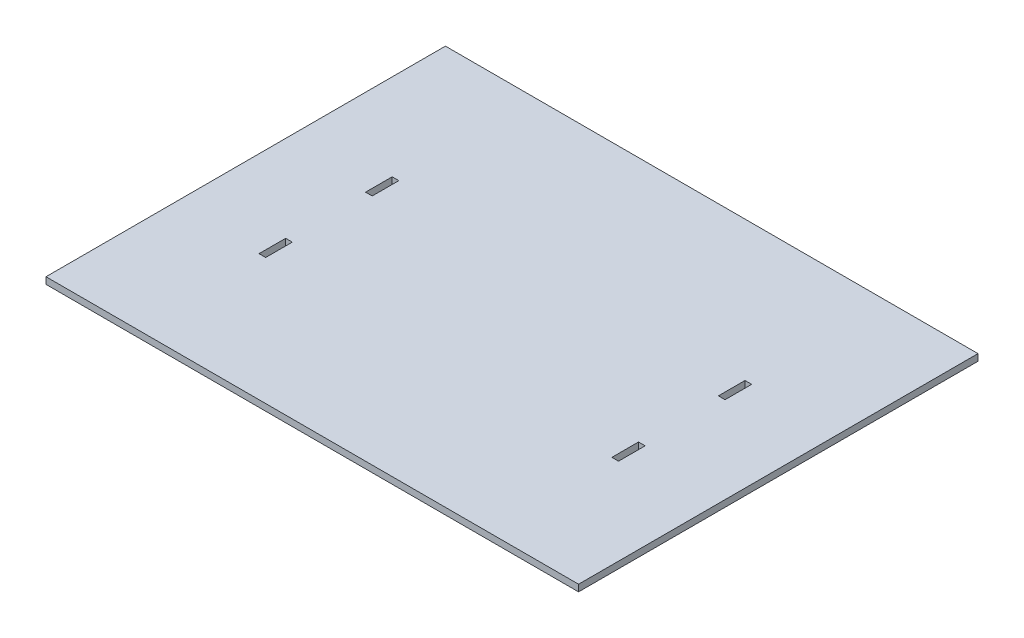
ISO-10303-21;
HEADER;
FILE_DESCRIPTION(('STEP AP214'),'2;1');
FILE_NAME('part.step','',(''),(''),'','','');
FILE_SCHEMA(('AUTOMOTIVE_DESIGN { 1 0 10303 214 1 1 1 1 }'));
ENDSEC;
DATA;
#1=APPLICATION_CONTEXT('core data for automotive mechanical design processes');
#2=APPLICATION_PROTOCOL_DEFINITION('international standard','automotive_design',2000,#1);
#3=PRODUCT_CONTEXT('',#1,'mechanical');
#4=PRODUCT('Part','Part','',(#3));
#5=PRODUCT_RELATED_PRODUCT_CATEGORY('part','',(#4));
#6=PRODUCT_DEFINITION_FORMATION('','',#4);
#7=PRODUCT_DEFINITION_CONTEXT('part definition',#1,'design');
#8=PRODUCT_DEFINITION('design','',#6,#7);
#9=PRODUCT_DEFINITION_SHAPE('','',#8);
#10=(LENGTH_UNIT() NAMED_UNIT(*) SI_UNIT(.MILLI.,.METRE.));
#11=(NAMED_UNIT(*) PLANE_ANGLE_UNIT() SI_UNIT($,.RADIAN.));
#12=(NAMED_UNIT(*) SI_UNIT($,.STERADIAN.) SOLID_ANGLE_UNIT());
#13=UNCERTAINTY_MEASURE_WITH_UNIT(LENGTH_MEASURE(1.E-05),#10,'distance_accuracy_value','');
#14=(GEOMETRIC_REPRESENTATION_CONTEXT(3) GLOBAL_UNCERTAINTY_ASSIGNED_CONTEXT((#13)) GLOBAL_UNIT_ASSIGNED_CONTEXT((#10,
#11,#12)) REPRESENTATION_CONTEXT('',''));
#15=CARTESIAN_POINT('',(0.,0.,0.));
#16=DIRECTION('',(0.,0.,1.));
#17=DIRECTION('',(1.,0.,0.));
#18=AXIS2_PLACEMENT_3D('',#15,#16,#17);
#19=CARTESIAN_POINT('',(0.,5.,0.));
#20=DIRECTION('',(0.,-1.,0.));
#21=DIRECTION('',(0.,0.,-1.));
#22=AXIS2_PLACEMENT_3D('',#19,#20,#21);
#23=PLANE('',#22);
#24=DIRECTION('',(0.,0.,1.));
#25=VECTOR('',#24,1.);
#26=CARTESIAN_POINT('',(130.,5.,-44.9999999999999));
#27=LINE('',#26,#25);
#28=CARTESIAN_POINT('',(130.,5.,-44.9999999999999));
#29=VERTEX_POINT('',#28);
#30=CARTESIAN_POINT('',(130.,5.,-24.9999999999999));
#31=VERTEX_POINT('',#30);
#32=EDGE_CURVE('E206',#29,#31,#27,.T.);
#33=ORIENTED_EDGE('',*,*,#32,.F.);
#34=DIRECTION('',(-1.,0.,0.));
#35=VECTOR('',#34,1.);
#36=CARTESIAN_POINT('',(130.,5.,-44.9999999999999));
#37=LINE('',#36,#35);
#38=CARTESIAN_POINT('',(135.,5.,-44.9999999999999));
#39=VERTEX_POINT('',#38);
#40=EDGE_CURVE('E214',#39,#29,#37,.T.);
#41=ORIENTED_EDGE('',*,*,#40,.F.);
#42=DIRECTION('',(0.,0.,-1.));
#43=VECTOR('',#42,1.);
#44=CARTESIAN_POINT('',(135.,5.,-44.9999999999999));
#45=LINE('',#44,#43);
#46=CARTESIAN_POINT('',(135.,5.,-24.9999999999999));
#47=VERTEX_POINT('',#46);
#48=EDGE_CURVE('E211',#47,#39,#45,.T.);
#49=ORIENTED_EDGE('',*,*,#48,.F.);
#50=DIRECTION('',(1.,0.,0.));
#51=VECTOR('',#50,1.);
#52=CARTESIAN_POINT('',(130.,5.,-24.9999999999999));
#53=LINE('',#52,#51);
#54=EDGE_CURVE('E208',#31,#47,#53,.T.);
#55=ORIENTED_EDGE('',*,*,#54,.F.);
#56=EDGE_LOOP('',(#33,#41,#49,#55));
#57=FACE_BOUND('',#56,.T.);
#58=DIRECTION('',(0.,0.,1.));
#59=VECTOR('',#58,1.);
#60=CARTESIAN_POINT('',(-135.,5.,-44.9999999999999));
#61=LINE('',#60,#59);
#62=CARTESIAN_POINT('',(-135.,5.,-44.9999999999999));
#63=VERTEX_POINT('',#62);
#64=CARTESIAN_POINT('',(-135.,5.,-24.9999999999999));
#65=VERTEX_POINT('',#64);
#66=EDGE_CURVE('E268',#63,#65,#61,.T.);
#67=ORIENTED_EDGE('',*,*,#66,.F.);
#68=DIRECTION('',(-1.,0.,0.));
#69=VECTOR('',#68,1.);
#70=CARTESIAN_POINT('',(-135.,5.,-44.9999999999999));
#71=LINE('',#70,#69);
#72=CARTESIAN_POINT('',(-130.,5.,-44.9999999999999));
#73=VERTEX_POINT('',#72);
#74=EDGE_CURVE('E276',#73,#63,#71,.T.);
#75=ORIENTED_EDGE('',*,*,#74,.F.);
#76=DIRECTION('',(0.,0.,-1.));
#77=VECTOR('',#76,1.);
#78=CARTESIAN_POINT('',(-130.,5.,-44.9999999999999));
#79=LINE('',#78,#77);
#80=CARTESIAN_POINT('',(-130.,5.,-24.9999999999999));
#81=VERTEX_POINT('',#80);
#82=EDGE_CURVE('E273',#81,#73,#79,.T.);
#83=ORIENTED_EDGE('',*,*,#82,.F.);
#84=DIRECTION('',(1.,0.,0.));
#85=VECTOR('',#84,1.);
#86=CARTESIAN_POINT('',(-135.,5.,-24.9999999999999));
#87=LINE('',#86,#85);
#88=EDGE_CURVE('E270',#65,#81,#87,.T.);
#89=ORIENTED_EDGE('',*,*,#88,.F.);
#90=EDGE_LOOP('',(#67,#75,#83,#89));
#91=FACE_BOUND('',#90,.T.);
#92=DIRECTION('',(0.,0.,1.));
#93=VECTOR('',#92,1.);
#94=CARTESIAN_POINT('',(-200.,5.,-150.));
#95=LINE('',#94,#93);
#96=CARTESIAN_POINT('',(-200.,5.,-150.));
#97=VERTEX_POINT('',#96);
#98=CARTESIAN_POINT('',(-200.,5.,150.));
#99=VERTEX_POINT('',#98);
#100=EDGE_CURVE('E299',#97,#99,#95,.T.);
#101=ORIENTED_EDGE('',*,*,#100,.T.);
#102=DIRECTION('',(1.,0.,0.));
#103=VECTOR('',#102,1.);
#104=CARTESIAN_POINT('',(200.,5.,150.));
#105=LINE('',#104,#103);
#106=CARTESIAN_POINT('',(200.,5.,150.));
#107=VERTEX_POINT('',#106);
#108=EDGE_CURVE('E302',#99,#107,#105,.T.);
#109=ORIENTED_EDGE('',*,*,#108,.T.);
#110=DIRECTION('',(0.,0.,-1.));
#111=VECTOR('',#110,1.);
#112=CARTESIAN_POINT('',(200.,5.,-150.));
#113=LINE('',#112,#111);
#114=CARTESIAN_POINT('',(200.,5.,-150.));
#115=VERTEX_POINT('',#114);
#116=EDGE_CURVE('E305',#107,#115,#113,.T.);
#117=ORIENTED_EDGE('',*,*,#116,.T.);
#118=DIRECTION('',(-1.,0.,0.));
#119=VECTOR('',#118,1.);
#120=CARTESIAN_POINT('',(200.,5.,-150.));
#121=LINE('',#120,#119);
#122=EDGE_CURVE('E307',#115,#97,#121,.T.);
#123=ORIENTED_EDGE('',*,*,#122,.T.);
#124=EDGE_LOOP('',(#101,#109,#117,#123));
#125=FACE_BOUND('',#124,.T.);
#126=DIRECTION('',(0.,0.,1.));
#127=VECTOR('',#126,1.);
#128=CARTESIAN_POINT('',(-135.,5.,35.0000000000001));
#129=LINE('',#128,#127);
#130=CARTESIAN_POINT('',(-135.,5.,35.0000000000001));
#131=VERTEX_POINT('',#130);
#132=CARTESIAN_POINT('',(-135.,5.,55.0000000000001));
#133=VERTEX_POINT('',#132);
#134=EDGE_CURVE('E237',#131,#133,#129,.T.);
#135=ORIENTED_EDGE('',*,*,#134,.F.);
#136=DIRECTION('',(-1.,0.,0.));
#137=VECTOR('',#136,1.);
#138=CARTESIAN_POINT('',(-135.,5.,35.0000000000001));
#139=LINE('',#138,#137);
#140=CARTESIAN_POINT('',(-130.,5.,35.0000000000001));
#141=VERTEX_POINT('',#140);
#142=EDGE_CURVE('E245',#141,#131,#139,.T.);
#143=ORIENTED_EDGE('',*,*,#142,.F.);
#144=DIRECTION('',(0.,0.,-1.));
#145=VECTOR('',#144,1.);
#146=CARTESIAN_POINT('',(-130.,5.,35.0000000000001));
#147=LINE('',#146,#145);
#148=CARTESIAN_POINT('',(-130.,5.,55.0000000000001));
#149=VERTEX_POINT('',#148);
#150=EDGE_CURVE('E242',#149,#141,#147,.T.);
#151=ORIENTED_EDGE('',*,*,#150,.F.);
#152=DIRECTION('',(1.,0.,0.));
#153=VECTOR('',#152,1.);
#154=CARTESIAN_POINT('',(-135.,5.,55.0000000000001));
#155=LINE('',#154,#153);
#156=EDGE_CURVE('E239',#133,#149,#155,.T.);
#157=ORIENTED_EDGE('',*,*,#156,.F.);
#158=EDGE_LOOP('',(#135,#143,#151,#157));
#159=FACE_BOUND('',#158,.T.);
#160=DIRECTION('',(0.,0.,1.));
#161=VECTOR('',#160,1.);
#162=CARTESIAN_POINT('',(130.,5.,35.0000000000001));
#163=LINE('',#162,#161);
#164=CARTESIAN_POINT('',(130.,5.,35.0000000000001));
#165=VERTEX_POINT('',#164);
#166=CARTESIAN_POINT('',(130.,5.,55.0000000000001));
#167=VERTEX_POINT('',#166);
#168=EDGE_CURVE('E170',#165,#167,#163,.T.);
#169=ORIENTED_EDGE('',*,*,#168,.F.);
#170=DIRECTION('',(-1.,0.,0.));
#171=VECTOR('',#170,1.);
#172=CARTESIAN_POINT('',(130.,5.,35.0000000000001));
#173=LINE('',#172,#171);
#174=CARTESIAN_POINT('',(135.,5.,35.0000000000001));
#175=VERTEX_POINT('',#174);
#176=EDGE_CURVE('E192',#175,#165,#173,.T.);
#177=ORIENTED_EDGE('',*,*,#176,.F.);
#178=DIRECTION('',(0.,0.,-1.));
#179=VECTOR('',#178,1.);
#180=CARTESIAN_POINT('',(135.,5.,35.0000000000001));
#181=LINE('',#180,#179);
#182=CARTESIAN_POINT('',(135.,5.,55.0000000000001));
#183=VERTEX_POINT('',#182);
#184=EDGE_CURVE('E190',#183,#175,#181,.T.);
#185=ORIENTED_EDGE('',*,*,#184,.F.);
#186=DIRECTION('',(1.,0.,0.));
#187=VECTOR('',#186,1.);
#188=CARTESIAN_POINT('',(130.,5.,55.0000000000001));
#189=LINE('',#188,#187);
#190=EDGE_CURVE('E178',#167,#183,#189,.T.);
#191=ORIENTED_EDGE('',*,*,#190,.F.);
#192=EDGE_LOOP('',(#169,#177,#185,#191));
#193=FACE_BOUND('',#192,.T.);
#194=ADVANCED_FACE('F33',(#57,#91,#125,#159,#193),#23,.F.);
#195=CARTESIAN_POINT('',(0.,0.,0.));
#196=DIRECTION('',(0.,-1.,0.));
#197=DIRECTION('',(0.,0.,-1.));
#198=AXIS2_PLACEMENT_3D('',#195,#196,#197);
#199=PLANE('',#198);
#200=DIRECTION('',(0.,0.,1.));
#201=VECTOR('',#200,1.);
#202=CARTESIAN_POINT('',(-200.,0.,-150.));
#203=LINE('',#202,#201);
#204=CARTESIAN_POINT('',(-200.,0.,-150.));
#205=VERTEX_POINT('',#204);
#206=CARTESIAN_POINT('',(-200.,0.,150.));
#207=VERTEX_POINT('',#206);
#208=EDGE_CURVE('E298',#205,#207,#203,.T.);
#209=ORIENTED_EDGE('',*,*,#208,.F.);
#210=DIRECTION('',(-1.,0.,0.));
#211=VECTOR('',#210,1.);
#212=CARTESIAN_POINT('',(200.,0.,-150.));
#213=LINE('',#212,#211);
#214=CARTESIAN_POINT('',(200.,0.,-150.));
#215=VERTEX_POINT('',#214);
#216=EDGE_CURVE('E303',#215,#205,#213,.T.);
#217=ORIENTED_EDGE('',*,*,#216,.F.);
#218=DIRECTION('',(0.,0.,-1.));
#219=VECTOR('',#218,1.);
#220=CARTESIAN_POINT('',(200.,0.,-150.));
#221=LINE('',#220,#219);
#222=CARTESIAN_POINT('',(200.,0.,150.));
#223=VERTEX_POINT('',#222);
#224=EDGE_CURVE('E314',#223,#215,#221,.T.);
#225=ORIENTED_EDGE('',*,*,#224,.F.);
#226=DIRECTION('',(1.,0.,0.));
#227=VECTOR('',#226,1.);
#228=CARTESIAN_POINT('',(200.,0.,150.));
#229=LINE('',#228,#227);
#230=EDGE_CURVE('E312',#207,#223,#229,.T.);
#231=ORIENTED_EDGE('',*,*,#230,.F.);
#232=EDGE_LOOP('',(#209,#217,#225,#231));
#233=FACE_BOUND('',#232,.T.);
#234=DIRECTION('',(-1.,0.,0.));
#235=VECTOR('',#234,1.);
#236=CARTESIAN_POINT('',(-135.,0.,-44.9999999999999));
#237=LINE('',#236,#235);
#238=CARTESIAN_POINT('',(-130.,0.,-44.9999999999999));
#239=VERTEX_POINT('',#238);
#240=CARTESIAN_POINT('',(-135.,0.,-44.9999999999999));
#241=VERTEX_POINT('',#240);
#242=EDGE_CURVE('E271',#239,#241,#237,.T.);
#243=ORIENTED_EDGE('',*,*,#242,.T.);
#244=DIRECTION('',(0.,0.,1.));
#245=VECTOR('',#244,1.);
#246=CARTESIAN_POINT('',(-135.,0.,-44.9999999999999));
#247=LINE('',#246,#245);
#248=CARTESIAN_POINT('',(-135.,0.,-24.9999999999999));
#249=VERTEX_POINT('',#248);
#250=EDGE_CURVE('E267',#241,#249,#247,.T.);
#251=ORIENTED_EDGE('',*,*,#250,.T.);
#252=DIRECTION('',(1.,0.,0.));
#253=VECTOR('',#252,1.);
#254=CARTESIAN_POINT('',(-135.,0.,-24.9999999999999));
#255=LINE('',#254,#253);
#256=CARTESIAN_POINT('',(-130.,0.,-24.9999999999999));
#257=VERTEX_POINT('',#256);
#258=EDGE_CURVE('E281',#249,#257,#255,.T.);
#259=ORIENTED_EDGE('',*,*,#258,.T.);
#260=DIRECTION('',(0.,0.,-1.));
#261=VECTOR('',#260,1.);
#262=CARTESIAN_POINT('',(-130.,0.,-44.9999999999999));
#263=LINE('',#262,#261);
#264=EDGE_CURVE('E284',#257,#239,#263,.T.);
#265=ORIENTED_EDGE('',*,*,#264,.T.);
#266=EDGE_LOOP('',(#243,#251,#259,#265));
#267=FACE_BOUND('',#266,.T.);
#268=DIRECTION('',(-1.,0.,0.));
#269=VECTOR('',#268,1.);
#270=CARTESIAN_POINT('',(-135.,0.,35.0000000000001));
#271=LINE('',#270,#269);
#272=CARTESIAN_POINT('',(-130.,0.,35.0000000000001));
#273=VERTEX_POINT('',#272);
#274=CARTESIAN_POINT('',(-135.,0.,35.0000000000001));
#275=VERTEX_POINT('',#274);
#276=EDGE_CURVE('E240',#273,#275,#271,.T.);
#277=ORIENTED_EDGE('',*,*,#276,.T.);
#278=DIRECTION('',(0.,0.,1.));
#279=VECTOR('',#278,1.);
#280=CARTESIAN_POINT('',(-135.,0.,35.0000000000001));
#281=LINE('',#280,#279);
#282=CARTESIAN_POINT('',(-135.,0.,55.0000000000001));
#283=VERTEX_POINT('',#282);
#284=EDGE_CURVE('E236',#275,#283,#281,.T.);
#285=ORIENTED_EDGE('',*,*,#284,.T.);
#286=DIRECTION('',(1.,0.,0.));
#287=VECTOR('',#286,1.);
#288=CARTESIAN_POINT('',(-135.,0.,55.0000000000001));
#289=LINE('',#288,#287);
#290=CARTESIAN_POINT('',(-130.,0.,55.0000000000001));
#291=VERTEX_POINT('',#290);
#292=EDGE_CURVE('E250',#283,#291,#289,.T.);
#293=ORIENTED_EDGE('',*,*,#292,.T.);
#294=DIRECTION('',(0.,0.,-1.));
#295=VECTOR('',#294,1.);
#296=CARTESIAN_POINT('',(-130.,0.,35.0000000000001));
#297=LINE('',#296,#295);
#298=EDGE_CURVE('E253',#291,#273,#297,.T.);
#299=ORIENTED_EDGE('',*,*,#298,.T.);
#300=EDGE_LOOP('',(#277,#285,#293,#299));
#301=FACE_BOUND('',#300,.T.);
#302=DIRECTION('',(-1.,0.,0.));
#303=VECTOR('',#302,1.);
#304=CARTESIAN_POINT('',(130.,0.,-44.9999999999999));
#305=LINE('',#304,#303);
#306=CARTESIAN_POINT('',(135.,0.,-44.9999999999999));
#307=VERTEX_POINT('',#306);
#308=CARTESIAN_POINT('',(130.,0.,-44.9999999999999));
#309=VERTEX_POINT('',#308);
#310=EDGE_CURVE('E209',#307,#309,#305,.T.);
#311=ORIENTED_EDGE('',*,*,#310,.T.);
#312=DIRECTION('',(0.,0.,1.));
#313=VECTOR('',#312,1.);
#314=CARTESIAN_POINT('',(130.,0.,-44.9999999999999));
#315=LINE('',#314,#313);
#316=CARTESIAN_POINT('',(130.,0.,-24.9999999999999));
#317=VERTEX_POINT('',#316);
#318=EDGE_CURVE('E186',#309,#317,#315,.T.);
#319=ORIENTED_EDGE('',*,*,#318,.T.);
#320=DIRECTION('',(1.,0.,0.));
#321=VECTOR('',#320,1.);
#322=CARTESIAN_POINT('',(130.,0.,-24.9999999999999));
#323=LINE('',#322,#321);
#324=CARTESIAN_POINT('',(135.,0.,-24.9999999999999));
#325=VERTEX_POINT('',#324);
#326=EDGE_CURVE('E219',#317,#325,#323,.T.);
#327=ORIENTED_EDGE('',*,*,#326,.T.);
#328=DIRECTION('',(0.,0.,-1.));
#329=VECTOR('',#328,1.);
#330=CARTESIAN_POINT('',(135.,0.,-44.9999999999999));
#331=LINE('',#330,#329);
#332=EDGE_CURVE('E222',#325,#307,#331,.T.);
#333=ORIENTED_EDGE('',*,*,#332,.T.);
#334=EDGE_LOOP('',(#311,#319,#327,#333));
#335=FACE_BOUND('',#334,.T.);
#336=DIRECTION('',(-1.,0.,0.));
#337=VECTOR('',#336,1.);
#338=CARTESIAN_POINT('',(130.,0.,35.0000000000001));
#339=LINE('',#338,#337);
#340=CARTESIAN_POINT('',(135.,0.,35.0000000000001));
#341=VERTEX_POINT('',#340);
#342=CARTESIAN_POINT('',(130.,0.,35.0000000000001));
#343=VERTEX_POINT('',#342);
#344=EDGE_CURVE('E179',#341,#343,#339,.T.);
#345=ORIENTED_EDGE('',*,*,#344,.T.);
#346=DIRECTION('',(0.,0.,1.));
#347=VECTOR('',#346,1.);
#348=CARTESIAN_POINT('',(130.,0.,35.0000000000001));
#349=LINE('',#348,#347);
#350=CARTESIAN_POINT('',(130.,0.,55.0000000000001));
#351=VERTEX_POINT('',#350);
#352=EDGE_CURVE('E56',#343,#351,#349,.T.);
#353=ORIENTED_EDGE('',*,*,#352,.T.);
#354=DIRECTION('',(1.,0.,0.));
#355=VECTOR('',#354,1.);
#356=CARTESIAN_POINT('',(130.,0.,55.0000000000001));
#357=LINE('',#356,#355);
#358=CARTESIAN_POINT('',(135.,0.,55.0000000000001));
#359=VERTEX_POINT('',#358);
#360=EDGE_CURVE('E185',#351,#359,#357,.T.);
#361=ORIENTED_EDGE('',*,*,#360,.T.);
#362=DIRECTION('',(0.,0.,-1.));
#363=VECTOR('',#362,1.);
#364=CARTESIAN_POINT('',(135.,0.,35.0000000000001));
#365=LINE('',#364,#363);
#366=EDGE_CURVE('E198',#359,#341,#365,.T.);
#367=ORIENTED_EDGE('',*,*,#366,.T.);
#368=EDGE_LOOP('',(#345,#353,#361,#367));
#369=FACE_BOUND('',#368,.T.);
#370=ADVANCED_FACE('F332',(#233,#267,#301,#335,#369),#199,.T.);
#371=CARTESIAN_POINT('',(-200.,5.,-150.));
#372=DIRECTION('',(1.,0.,0.));
#373=DIRECTION('',(0.,0.,-1.));
#374=AXIS2_PLACEMENT_3D('',#371,#372,#373);
#375=PLANE('',#374);
#376=ORIENTED_EDGE('',*,*,#208,.T.);
#377=DIRECTION('',(0.,-1.,0.));
#378=VECTOR('',#377,1.);
#379=CARTESIAN_POINT('',(-200.,5.,150.));
#380=LINE('',#379,#378);
#381=EDGE_CURVE('E11',#99,#207,#380,.T.);
#382=ORIENTED_EDGE('',*,*,#381,.F.);
#383=ORIENTED_EDGE('',*,*,#100,.F.);
#384=DIRECTION('',(0.,-1.,0.));
#385=VECTOR('',#384,1.);
#386=CARTESIAN_POINT('',(-200.,5.,-150.));
#387=LINE('',#386,#385);
#388=EDGE_CURVE('E309',#97,#205,#387,.T.);
#389=ORIENTED_EDGE('',*,*,#388,.T.);
#390=EDGE_LOOP('',(#376,#382,#383,#389));
#391=FACE_BOUND('',#390,.T.);
#392=ADVANCED_FACE('F35',(#391),#375,.F.);
#393=CARTESIAN_POINT('',(200.,5.,150.));
#394=DIRECTION('',(0.,0.,-1.));
#395=DIRECTION('',(-1.,0.,0.));
#396=AXIS2_PLACEMENT_3D('',#393,#394,#395);
#397=PLANE('',#396);
#398=ORIENTED_EDGE('',*,*,#230,.T.);
#399=DIRECTION('',(0.,-1.,0.));
#400=VECTOR('',#399,1.);
#401=CARTESIAN_POINT('',(200.,5.,150.));
#402=LINE('',#401,#400);
#403=EDGE_CURVE('E41',#107,#223,#402,.T.);
#404=ORIENTED_EDGE('',*,*,#403,.F.);
#405=ORIENTED_EDGE('',*,*,#108,.F.);
#406=ORIENTED_EDGE('',*,*,#381,.T.);
#407=EDGE_LOOP('',(#398,#404,#405,#406));
#408=FACE_BOUND('',#407,.T.);
#409=ADVANCED_FACE('F343',(#408),#397,.F.);
#410=CARTESIAN_POINT('',(200.,5.,-150.));
#411=DIRECTION('',(-1.,0.,0.));
#412=DIRECTION('',(0.,0.,1.));
#413=AXIS2_PLACEMENT_3D('',#410,#411,#412);
#414=PLANE('',#413);
#415=ORIENTED_EDGE('',*,*,#224,.T.);
#416=DIRECTION('',(0.,-1.,0.));
#417=VECTOR('',#416,1.);
#418=CARTESIAN_POINT('',(200.,5.,-150.));
#419=LINE('',#418,#417);
#420=EDGE_CURVE('E319',#115,#215,#419,.T.);
#421=ORIENTED_EDGE('',*,*,#420,.F.);
#422=ORIENTED_EDGE('',*,*,#116,.F.);
#423=ORIENTED_EDGE('',*,*,#403,.T.);
#424=EDGE_LOOP('',(#415,#421,#422,#423));
#425=FACE_BOUND('',#424,.T.);
#426=ADVANCED_FACE('F326',(#425),#414,.F.);
#427=CARTESIAN_POINT('',(200.,5.,-150.));
#428=DIRECTION('',(0.,0.,1.));
#429=DIRECTION('',(1.,0.,0.));
#430=AXIS2_PLACEMENT_3D('',#427,#428,#429);
#431=PLANE('',#430);
#432=ORIENTED_EDGE('',*,*,#216,.T.);
#433=ORIENTED_EDGE('',*,*,#388,.F.);
#434=ORIENTED_EDGE('',*,*,#122,.F.);
#435=ORIENTED_EDGE('',*,*,#420,.T.);
#436=EDGE_LOOP('',(#432,#433,#434,#435));
#437=FACE_BOUND('',#436,.T.);
#438=ADVANCED_FACE('F336',(#437),#431,.F.);
#439=CARTESIAN_POINT('',(-135.,5.,-44.9999999999999));
#440=DIRECTION('',(1.,0.,0.));
#441=DIRECTION('',(0.,0.,-1.));
#442=AXIS2_PLACEMENT_3D('',#439,#440,#441);
#443=PLANE('',#442);
#444=ORIENTED_EDGE('',*,*,#250,.F.);
#445=DIRECTION('',(0.,-1.,0.));
#446=VECTOR('',#445,1.);
#447=CARTESIAN_POINT('',(-135.,5.,-44.9999999999999));
#448=LINE('',#447,#446);
#449=EDGE_CURVE('E278',#63,#241,#448,.T.);
#450=ORIENTED_EDGE('',*,*,#449,.F.);
#451=ORIENTED_EDGE('',*,*,#66,.T.);
#452=DIRECTION('',(0.,-1.,0.));
#453=VECTOR('',#452,1.);
#454=CARTESIAN_POINT('',(-135.,5.,-24.9999999999999));
#455=LINE('',#454,#453);
#456=EDGE_CURVE('E295',#65,#249,#455,.T.);
#457=ORIENTED_EDGE('',*,*,#456,.T.);
#458=EDGE_LOOP('',(#444,#450,#451,#457));
#459=FACE_BOUND('',#458,.T.);
#460=ADVANCED_FACE('F360',(#459),#443,.T.);
#461=CARTESIAN_POINT('',(-135.,5.,-24.9999999999999));
#462=DIRECTION('',(0.,0.,-1.));
#463=DIRECTION('',(-1.,0.,0.));
#464=AXIS2_PLACEMENT_3D('',#461,#462,#463);
#465=PLANE('',#464);
#466=ORIENTED_EDGE('',*,*,#258,.F.);
#467=ORIENTED_EDGE('',*,*,#456,.F.);
#468=ORIENTED_EDGE('',*,*,#88,.T.);
#469=DIRECTION('',(0.,-1.,0.));
#470=VECTOR('',#469,1.);
#471=CARTESIAN_POINT('',(-130.,5.,-24.9999999999999));
#472=LINE('',#471,#470);
#473=EDGE_CURVE('E293',#81,#257,#472,.T.);
#474=ORIENTED_EDGE('',*,*,#473,.T.);
#475=EDGE_LOOP('',(#466,#467,#468,#474));
#476=FACE_BOUND('',#475,.T.);
#477=ADVANCED_FACE('F367',(#476),#465,.T.);
#478=CARTESIAN_POINT('',(-130.,5.,-44.9999999999999));
#479=DIRECTION('',(-1.,0.,0.));
#480=DIRECTION('',(0.,0.,1.));
#481=AXIS2_PLACEMENT_3D('',#478,#479,#480);
#482=PLANE('',#481);
#483=ORIENTED_EDGE('',*,*,#264,.F.);
#484=ORIENTED_EDGE('',*,*,#473,.F.);
#485=ORIENTED_EDGE('',*,*,#82,.T.);
#486=DIRECTION('',(0.,-1.,0.));
#487=VECTOR('',#486,1.);
#488=CARTESIAN_POINT('',(-130.,5.,-44.9999999999999));
#489=LINE('',#488,#487);
#490=EDGE_CURVE('E291',#73,#239,#489,.T.);
#491=ORIENTED_EDGE('',*,*,#490,.T.);
#492=EDGE_LOOP('',(#483,#484,#485,#491));
#493=FACE_BOUND('',#492,.T.);
#494=ADVANCED_FACE('F372',(#493),#482,.T.);
#495=CARTESIAN_POINT('',(-135.,5.,-44.9999999999999));
#496=DIRECTION('',(0.,0.,1.));
#497=DIRECTION('',(1.,0.,0.));
#498=AXIS2_PLACEMENT_3D('',#495,#496,#497);
#499=PLANE('',#498);
#500=ORIENTED_EDGE('',*,*,#242,.F.);
#501=ORIENTED_EDGE('',*,*,#490,.F.);
#502=ORIENTED_EDGE('',*,*,#74,.T.);
#503=ORIENTED_EDGE('',*,*,#449,.T.);
#504=EDGE_LOOP('',(#500,#501,#502,#503));
#505=FACE_BOUND('',#504,.T.);
#506=ADVANCED_FACE('F379',(#505),#499,.T.);
#507=CARTESIAN_POINT('',(-135.,5.,35.0000000000001));
#508=DIRECTION('',(1.,0.,0.));
#509=DIRECTION('',(0.,0.,-1.));
#510=AXIS2_PLACEMENT_3D('',#507,#508,#509);
#511=PLANE('',#510);
#512=ORIENTED_EDGE('',*,*,#284,.F.);
#513=DIRECTION('',(0.,-1.,0.));
#514=VECTOR('',#513,1.);
#515=CARTESIAN_POINT('',(-135.,5.,35.0000000000001));
#516=LINE('',#515,#514);
#517=EDGE_CURVE('E247',#131,#275,#516,.T.);
#518=ORIENTED_EDGE('',*,*,#517,.F.);
#519=ORIENTED_EDGE('',*,*,#134,.T.);
#520=DIRECTION('',(0.,-1.,0.));
#521=VECTOR('',#520,1.);
#522=CARTESIAN_POINT('',(-135.,5.,55.0000000000001));
#523=LINE('',#522,#521);
#524=EDGE_CURVE('E264',#133,#283,#523,.T.);
#525=ORIENTED_EDGE('',*,*,#524,.T.);
#526=EDGE_LOOP('',(#512,#518,#519,#525));
#527=FACE_BOUND('',#526,.T.);
#528=ADVANCED_FACE('F392',(#527),#511,.T.);
#529=CARTESIAN_POINT('',(-135.,5.,55.0000000000001));
#530=DIRECTION('',(0.,0.,-1.));
#531=DIRECTION('',(-1.,0.,0.));
#532=AXIS2_PLACEMENT_3D('',#529,#530,#531);
#533=PLANE('',#532);
#534=ORIENTED_EDGE('',*,*,#292,.F.);
#535=ORIENTED_EDGE('',*,*,#524,.F.);
#536=ORIENTED_EDGE('',*,*,#156,.T.);
#537=DIRECTION('',(0.,-1.,0.));
#538=VECTOR('',#537,1.);
#539=CARTESIAN_POINT('',(-130.,5.,55.0000000000001));
#540=LINE('',#539,#538);
#541=EDGE_CURVE('E262',#149,#291,#540,.T.);
#542=ORIENTED_EDGE('',*,*,#541,.T.);
#543=EDGE_LOOP('',(#534,#535,#536,#542));
#544=FACE_BOUND('',#543,.T.);
#545=ADVANCED_FACE('F397',(#544),#533,.T.);
#546=CARTESIAN_POINT('',(-130.,5.,35.0000000000001));
#547=DIRECTION('',(-1.,0.,0.));
#548=DIRECTION('',(0.,0.,1.));
#549=AXIS2_PLACEMENT_3D('',#546,#547,#548);
#550=PLANE('',#549);
#551=ORIENTED_EDGE('',*,*,#298,.F.);
#552=ORIENTED_EDGE('',*,*,#541,.F.);
#553=ORIENTED_EDGE('',*,*,#150,.T.);
#554=DIRECTION('',(0.,-1.,0.));
#555=VECTOR('',#554,1.);
#556=CARTESIAN_POINT('',(-130.,5.,35.0000000000001));
#557=LINE('',#556,#555);
#558=EDGE_CURVE('E260',#141,#273,#557,.T.);
#559=ORIENTED_EDGE('',*,*,#558,.T.);
#560=EDGE_LOOP('',(#551,#552,#553,#559));
#561=FACE_BOUND('',#560,.T.);
#562=ADVANCED_FACE('F401',(#561),#550,.T.);
#563=CARTESIAN_POINT('',(-135.,5.,35.0000000000001));
#564=DIRECTION('',(0.,0.,1.));
#565=DIRECTION('',(1.,0.,0.));
#566=AXIS2_PLACEMENT_3D('',#563,#564,#565);
#567=PLANE('',#566);
#568=ORIENTED_EDGE('',*,*,#276,.F.);
#569=ORIENTED_EDGE('',*,*,#558,.F.);
#570=ORIENTED_EDGE('',*,*,#142,.T.);
#571=ORIENTED_EDGE('',*,*,#517,.T.);
#572=EDGE_LOOP('',(#568,#569,#570,#571));
#573=FACE_BOUND('',#572,.T.);
#574=ADVANCED_FACE('F405',(#573),#567,.T.);
#575=CARTESIAN_POINT('',(130.,5.,-44.9999999999999));
#576=DIRECTION('',(1.,0.,0.));
#577=DIRECTION('',(0.,0.,-1.));
#578=AXIS2_PLACEMENT_3D('',#575,#576,#577);
#579=PLANE('',#578);
#580=ORIENTED_EDGE('',*,*,#318,.F.);
#581=DIRECTION('',(0.,-1.,0.));
#582=VECTOR('',#581,1.);
#583=CARTESIAN_POINT('',(130.,5.,-44.9999999999999));
#584=LINE('',#583,#582);
#585=EDGE_CURVE('E216',#29,#309,#584,.T.);
#586=ORIENTED_EDGE('',*,*,#585,.F.);
#587=ORIENTED_EDGE('',*,*,#32,.T.);
#588=DIRECTION('',(0.,-1.,0.));
#589=VECTOR('',#588,1.);
#590=CARTESIAN_POINT('',(130.,5.,-24.9999999999999));
#591=LINE('',#590,#589);
#592=EDGE_CURVE('E233',#31,#317,#591,.T.);
#593=ORIENTED_EDGE('',*,*,#592,.T.);
#594=EDGE_LOOP('',(#580,#586,#587,#593));
#595=FACE_BOUND('',#594,.T.);
#596=ADVANCED_FACE('F409',(#595),#579,.T.);
#597=CARTESIAN_POINT('',(130.,5.,-24.9999999999999));
#598=DIRECTION('',(0.,0.,-1.));
#599=DIRECTION('',(-1.,0.,0.));
#600=AXIS2_PLACEMENT_3D('',#597,#598,#599);
#601=PLANE('',#600);
#602=ORIENTED_EDGE('',*,*,#326,.F.);
#603=ORIENTED_EDGE('',*,*,#592,.F.);
#604=ORIENTED_EDGE('',*,*,#54,.T.);
#605=DIRECTION('',(0.,-1.,0.));
#606=VECTOR('',#605,1.);
#607=CARTESIAN_POINT('',(135.,5.,-24.9999999999999));
#608=LINE('',#607,#606);
#609=EDGE_CURVE('E231',#47,#325,#608,.T.);
#610=ORIENTED_EDGE('',*,*,#609,.T.);
#611=EDGE_LOOP('',(#602,#603,#604,#610));
#612=FACE_BOUND('',#611,.T.);
#613=ADVANCED_FACE('F413',(#612),#601,.T.);
#614=CARTESIAN_POINT('',(135.,5.,-44.9999999999999));
#615=DIRECTION('',(-1.,0.,0.));
#616=DIRECTION('',(0.,0.,1.));
#617=AXIS2_PLACEMENT_3D('',#614,#615,#616);
#618=PLANE('',#617);
#619=ORIENTED_EDGE('',*,*,#332,.F.);
#620=ORIENTED_EDGE('',*,*,#609,.F.);
#621=ORIENTED_EDGE('',*,*,#48,.T.);
#622=DIRECTION('',(0.,-1.,0.));
#623=VECTOR('',#622,1.);
#624=CARTESIAN_POINT('',(135.,5.,-44.9999999999999));
#625=LINE('',#624,#623);
#626=EDGE_CURVE('E229',#39,#307,#625,.T.);
#627=ORIENTED_EDGE('',*,*,#626,.T.);
#628=EDGE_LOOP('',(#619,#620,#621,#627));
#629=FACE_BOUND('',#628,.T.);
#630=ADVANCED_FACE('F417',(#629),#618,.T.);
#631=CARTESIAN_POINT('',(130.,5.,-44.9999999999999));
#632=DIRECTION('',(0.,0.,1.));
#633=DIRECTION('',(1.,0.,0.));
#634=AXIS2_PLACEMENT_3D('',#631,#632,#633);
#635=PLANE('',#634);
#636=ORIENTED_EDGE('',*,*,#310,.F.);
#637=ORIENTED_EDGE('',*,*,#626,.F.);
#638=ORIENTED_EDGE('',*,*,#40,.T.);
#639=ORIENTED_EDGE('',*,*,#585,.T.);
#640=EDGE_LOOP('',(#636,#637,#638,#639));
#641=FACE_BOUND('',#640,.T.);
#642=ADVANCED_FACE('F421',(#641),#635,.T.);
#643=CARTESIAN_POINT('',(130.,5.,35.0000000000001));
#644=DIRECTION('',(1.,0.,0.));
#645=DIRECTION('',(0.,0.,-1.));
#646=AXIS2_PLACEMENT_3D('',#643,#644,#645);
#647=PLANE('',#646);
#648=ORIENTED_EDGE('',*,*,#352,.F.);
#649=DIRECTION('',(0.,-1.,0.));
#650=VECTOR('',#649,1.);
#651=CARTESIAN_POINT('',(130.,5.,35.0000000000001));
#652=LINE('',#651,#650);
#653=EDGE_CURVE('E174',#165,#343,#652,.T.);
#654=ORIENTED_EDGE('',*,*,#653,.F.);
#655=ORIENTED_EDGE('',*,*,#168,.T.);
#656=DIRECTION('',(0.,-1.,0.));
#657=VECTOR('',#656,1.);
#658=CARTESIAN_POINT('',(130.,5.,55.0000000000001));
#659=LINE('',#658,#657);
#660=EDGE_CURVE('E173',#167,#351,#659,.T.);
#661=ORIENTED_EDGE('',*,*,#660,.T.);
#662=EDGE_LOOP('',(#648,#654,#655,#661));
#663=FACE_BOUND('',#662,.T.);
#664=ADVANCED_FACE('F172',(#663),#647,.T.);
#665=CARTESIAN_POINT('',(130.,5.,55.0000000000001));
#666=DIRECTION('',(0.,0.,-1.));
#667=DIRECTION('',(-1.,0.,0.));
#668=AXIS2_PLACEMENT_3D('',#665,#666,#667);
#669=PLANE('',#668);
#670=ORIENTED_EDGE('',*,*,#360,.F.);
#671=ORIENTED_EDGE('',*,*,#660,.F.);
#672=ORIENTED_EDGE('',*,*,#190,.T.);
#673=DIRECTION('',(0.,-1.,0.));
#674=VECTOR('',#673,1.);
#675=CARTESIAN_POINT('',(135.,5.,55.0000000000001));
#676=LINE('',#675,#674);
#677=EDGE_CURVE('E187',#183,#359,#676,.T.);
#678=ORIENTED_EDGE('',*,*,#677,.T.);
#679=EDGE_LOOP('',(#670,#671,#672,#678));
#680=FACE_BOUND('',#679,.T.);
#681=ADVANCED_FACE('F182',(#680),#669,.T.);
#682=CARTESIAN_POINT('',(135.,5.,35.0000000000001));
#683=DIRECTION('',(-1.,0.,0.));
#684=DIRECTION('',(0.,0.,1.));
#685=AXIS2_PLACEMENT_3D('',#682,#683,#684);
#686=PLANE('',#685);
#687=ORIENTED_EDGE('',*,*,#366,.F.);
#688=ORIENTED_EDGE('',*,*,#677,.F.);
#689=ORIENTED_EDGE('',*,*,#184,.T.);
#690=DIRECTION('',(0.,-1.,0.));
#691=VECTOR('',#690,1.);
#692=CARTESIAN_POINT('',(135.,5.,35.0000000000001));
#693=LINE('',#692,#691);
#694=EDGE_CURVE('E48',#175,#341,#693,.T.);
#695=ORIENTED_EDGE('',*,*,#694,.T.);
#696=EDGE_LOOP('',(#687,#688,#689,#695));
#697=FACE_BOUND('',#696,.T.);
#698=ADVANCED_FACE('F430',(#697),#686,.T.);
#699=CARTESIAN_POINT('',(130.,5.,35.0000000000001));
#700=DIRECTION('',(0.,0.,1.));
#701=DIRECTION('',(1.,0.,0.));
#702=AXIS2_PLACEMENT_3D('',#699,#700,#701);
#703=PLANE('',#702);
#704=ORIENTED_EDGE('',*,*,#344,.F.);
#705=ORIENTED_EDGE('',*,*,#694,.F.);
#706=ORIENTED_EDGE('',*,*,#176,.T.);
#707=ORIENTED_EDGE('',*,*,#653,.T.);
#708=EDGE_LOOP('',(#704,#705,#706,#707));
#709=FACE_BOUND('',#708,.T.);
#710=ADVANCED_FACE('F433',(#709),#703,.T.);
#711=CLOSED_SHELL('',(#194,#370,#392,#409,#426,#438,#460,#477,#494,#506,#528,#545,#562,#574,
#596,#613,#630,#642,#664,#681,#698,#710));
#712=MANIFOLD_SOLID_BREP('B2',#711);
#713=ADVANCED_BREP_SHAPE_REPRESENTATION('',(#18,#712),#14);
#714=SHAPE_DEFINITION_REPRESENTATION(#9,#713);
ENDSEC;
END-ISO-10303-21;
